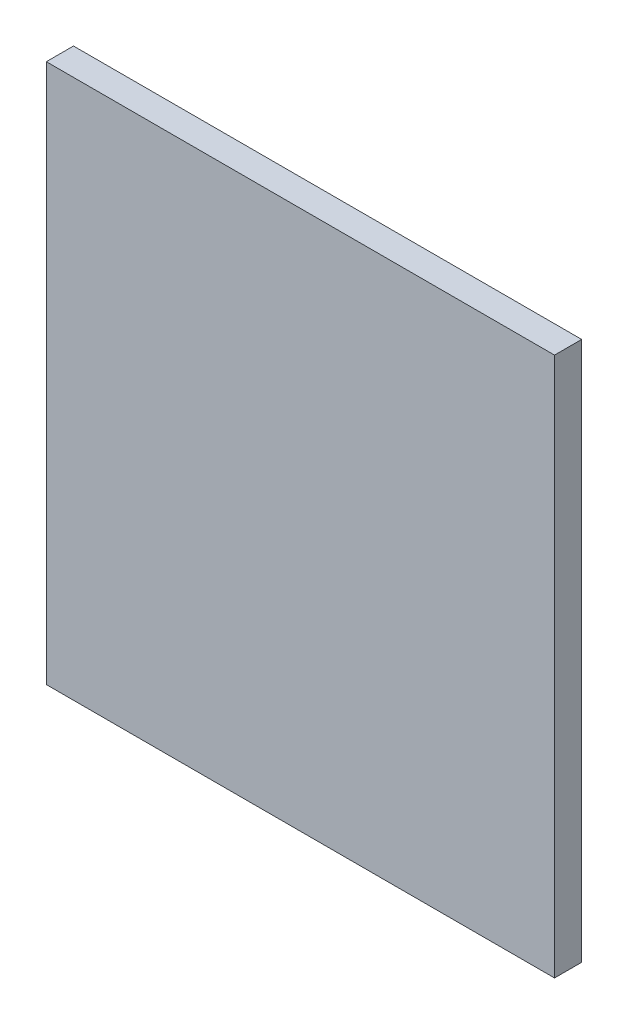
ISO-10303-21;
HEADER;
FILE_DESCRIPTION(('STEP AP214'),'2;1');
FILE_NAME('part.step','',(''),(''),'','','');
FILE_SCHEMA(('AUTOMOTIVE_DESIGN { 1 0 10303 214 1 1 1 1 }'));
ENDSEC;
DATA;
#1=APPLICATION_CONTEXT('core data for automotive mechanical design processes');
#2=APPLICATION_PROTOCOL_DEFINITION('international standard','automotive_design',2000,#1);
#3=PRODUCT_CONTEXT('',#1,'mechanical');
#4=PRODUCT('Part','Part','',(#3));
#5=PRODUCT_RELATED_PRODUCT_CATEGORY('part','',(#4));
#6=PRODUCT_DEFINITION_FORMATION('','',#4);
#7=PRODUCT_DEFINITION_CONTEXT('part definition',#1,'design');
#8=PRODUCT_DEFINITION('design','',#6,#7);
#9=PRODUCT_DEFINITION_SHAPE('','',#8);
#10=(LENGTH_UNIT() NAMED_UNIT(*) SI_UNIT(.MILLI.,.METRE.));
#11=(NAMED_UNIT(*) PLANE_ANGLE_UNIT() SI_UNIT($,.RADIAN.));
#12=(NAMED_UNIT(*) SI_UNIT($,.STERADIAN.) SOLID_ANGLE_UNIT());
#13=UNCERTAINTY_MEASURE_WITH_UNIT(LENGTH_MEASURE(1.E-05),#10,'distance_accuracy_value','');
#14=(GEOMETRIC_REPRESENTATION_CONTEXT(3) GLOBAL_UNCERTAINTY_ASSIGNED_CONTEXT((#13)) GLOBAL_UNIT_ASSIGNED_CONTEXT((#10,
#11,#12)) REPRESENTATION_CONTEXT('',''));
#15=CARTESIAN_POINT('',(0.,0.,0.));
#16=DIRECTION('',(0.,0.,1.));
#17=DIRECTION('',(1.,0.,0.));
#18=AXIS2_PLACEMENT_3D('',#15,#16,#17);
#19=CARTESIAN_POINT('',(0.,0.,1.8));
#20=DIRECTION('',(0.,0.,1.));
#21=DIRECTION('',(1.,0.,0.));
#22=AXIS2_PLACEMENT_3D('',#19,#20,#21);
#23=PLANE('',#22);
#24=DIRECTION('',(-1.,0.,0.));
#25=VECTOR('',#24,1.);
#26=CARTESIAN_POINT('',(0.,16.3489367162519,1.8));
#27=LINE('',#26,#25);
#28=CARTESIAN_POINT('',(-40.9214022690634,16.3489367162519,1.8));
#29=VERTEX_POINT('',#28);
#30=CARTESIAN_POINT('',(-74.598680775992,16.3489367162519,1.8));
#31=VERTEX_POINT('',#30);
#32=EDGE_CURVE('E95',#29,#31,#27,.T.);
#33=ORIENTED_EDGE('',*,*,#32,.T.);
#34=DIRECTION('',(0.,-1.,0.));
#35=VECTOR('',#34,1.);
#36=CARTESIAN_POINT('',(-74.598680775992,0.,1.8));
#37=LINE('',#36,#35);
#38=CARTESIAN_POINT('',(-74.598680775992,-19.3988803486214,1.8));
#39=VERTEX_POINT('',#38);
#40=EDGE_CURVE('E11',#31,#39,#37,.T.);
#41=ORIENTED_EDGE('',*,*,#40,.T.);
#42=DIRECTION('',(1.,0.,0.));
#43=VECTOR('',#42,1.);
#44=CARTESIAN_POINT('',(0.,-19.3988803486214,1.8));
#45=LINE('',#44,#43);
#46=CARTESIAN_POINT('',(-40.9214022690634,-19.3988803486214,1.8));
#47=VERTEX_POINT('',#46);
#48=EDGE_CURVE('E41',#39,#47,#45,.T.);
#49=ORIENTED_EDGE('',*,*,#48,.T.);
#50=DIRECTION('',(0.,1.,0.));
#51=VECTOR('',#50,1.);
#52=CARTESIAN_POINT('',(-40.9214022690634,0.,1.8));
#53=LINE('',#52,#51);
#54=EDGE_CURVE('E99',#47,#29,#53,.T.);
#55=ORIENTED_EDGE('',*,*,#54,.T.);
#56=EDGE_LOOP('',(#33,#41,#49,#55));
#57=FACE_BOUND('',#56,.T.);
#58=ADVANCED_FACE('F33',(#57),#23,.T.);
#59=CARTESIAN_POINT('',(-74.598680775992,-19.3988803486214,16.8));
#60=DIRECTION('',(-1.,0.,0.));
#61=DIRECTION('',(0.,0.,1.));
#62=AXIS2_PLACEMENT_3D('',#59,#60,#61);
#63=PLANE('',#62);
#64=DIRECTION('',(0.,-1.,0.));
#65=VECTOR('',#64,1.);
#66=CARTESIAN_POINT('',(-74.598680775992,0.,0.));
#67=LINE('',#66,#65);
#68=CARTESIAN_POINT('',(-74.598680775992,16.3489367162519,0.));
#69=VERTEX_POINT('',#68);
#70=CARTESIAN_POINT('',(-74.598680775992,-19.3988803486214,0.));
#71=VERTEX_POINT('',#70);
#72=EDGE_CURVE('E139',#69,#71,#67,.T.);
#73=ORIENTED_EDGE('',*,*,#72,.T.);
#74=DIRECTION('',(0.,0.,-1.));
#75=VECTOR('',#74,1.);
#76=CARTESIAN_POINT('',(-74.598680775992,-19.3988803486214,16.8));
#77=LINE('',#76,#75);
#78=EDGE_CURVE('E153',#39,#71,#77,.T.);
#79=ORIENTED_EDGE('',*,*,#78,.F.);
#80=ORIENTED_EDGE('',*,*,#40,.F.);
#81=DIRECTION('',(0.,0.,-1.));
#82=VECTOR('',#81,1.);
#83=CARTESIAN_POINT('',(-74.598680775992,16.3489367162519,16.8));
#84=LINE('',#83,#82);
#85=EDGE_CURVE('E53',#31,#69,#84,.T.);
#86=ORIENTED_EDGE('',*,*,#85,.T.);
#87=EDGE_LOOP('',(#73,#79,#80,#86));
#88=FACE_BOUND('',#87,.T.);
#89=ADVANCED_FACE('F164',(#88),#63,.T.);
#90=CARTESIAN_POINT('',(-74.598680775992,-19.3988803486214,16.8));
#91=DIRECTION('',(0.,-1.,0.));
#92=DIRECTION('',(0.,0.,-1.));
#93=AXIS2_PLACEMENT_3D('',#90,#91,#92);
#94=PLANE('',#93);
#95=DIRECTION('',(1.,0.,0.));
#96=VECTOR('',#95,1.);
#97=CARTESIAN_POINT('',(0.,-19.3988803486214,0.));
#98=LINE('',#97,#96);
#99=CARTESIAN_POINT('',(-40.9214022690634,-19.3988803486214,0.));
#100=VERTEX_POINT('',#99);
#101=EDGE_CURVE('E148',#71,#100,#98,.T.);
#102=ORIENTED_EDGE('',*,*,#101,.T.);
#103=DIRECTION('',(0.,0.,-1.));
#104=VECTOR('',#103,1.);
#105=CARTESIAN_POINT('',(-40.9214022690634,-19.3988803486214,16.8));
#106=LINE('',#105,#104);
#107=EDGE_CURVE('E109',#47,#100,#106,.T.);
#108=ORIENTED_EDGE('',*,*,#107,.F.);
#109=ORIENTED_EDGE('',*,*,#48,.F.);
#110=ORIENTED_EDGE('',*,*,#78,.T.);
#111=EDGE_LOOP('',(#102,#108,#109,#110));
#112=FACE_BOUND('',#111,.T.);
#113=ADVANCED_FACE('F160',(#112),#94,.T.);
#114=CARTESIAN_POINT('',(-40.9214022690634,-19.3988803486214,16.8));
#115=DIRECTION('',(1.,0.,0.));
#116=DIRECTION('',(0.,0.,-1.));
#117=AXIS2_PLACEMENT_3D('',#114,#115,#116);
#118=PLANE('',#117);
#119=DIRECTION('',(0.,1.,0.));
#120=VECTOR('',#119,1.);
#121=CARTESIAN_POINT('',(-40.9214022690634,0.,0.));
#122=LINE('',#121,#120);
#123=CARTESIAN_POINT('',(-40.9214022690634,16.3489367162519,0.));
#124=VERTEX_POINT('',#123);
#125=EDGE_CURVE('E107',#100,#124,#122,.T.);
#126=ORIENTED_EDGE('',*,*,#125,.T.);
#127=DIRECTION('',(0.,0.,-1.));
#128=VECTOR('',#127,1.);
#129=CARTESIAN_POINT('',(-40.9214022690634,16.3489367162519,16.8));
#130=LINE('',#129,#128);
#131=EDGE_CURVE('E48',#29,#124,#130,.T.);
#132=ORIENTED_EDGE('',*,*,#131,.F.);
#133=ORIENTED_EDGE('',*,*,#54,.F.);
#134=ORIENTED_EDGE('',*,*,#107,.T.);
#135=EDGE_LOOP('',(#126,#132,#133,#134));
#136=FACE_BOUND('',#135,.T.);
#137=ADVANCED_FACE('F103',(#136),#118,.T.);
#138=CARTESIAN_POINT('',(-74.598680775992,16.3489367162519,16.8));
#139=DIRECTION('',(0.,1.,0.));
#140=DIRECTION('',(0.,0.,1.));
#141=AXIS2_PLACEMENT_3D('',#138,#139,#140);
#142=PLANE('',#141);
#143=DIRECTION('',(-1.,0.,0.));
#144=VECTOR('',#143,1.);
#145=CARTESIAN_POINT('',(0.,16.3489367162519,0.));
#146=LINE('',#145,#144);
#147=EDGE_CURVE('E151',#124,#69,#146,.T.);
#148=ORIENTED_EDGE('',*,*,#147,.T.);
#149=ORIENTED_EDGE('',*,*,#85,.F.);
#150=ORIENTED_EDGE('',*,*,#32,.F.);
#151=ORIENTED_EDGE('',*,*,#131,.T.);
#152=EDGE_LOOP('',(#148,#149,#150,#151));
#153=FACE_BOUND('',#152,.T.);
#154=ADVANCED_FACE('F96',(#153),#142,.T.);
#155=CARTESIAN_POINT('',(0.,0.,0.));
#156=DIRECTION('',(0.,0.,1.));
#157=DIRECTION('',(1.,0.,0.));
#158=AXIS2_PLACEMENT_3D('',#155,#156,#157);
#159=PLANE('',#158);
#160=DIRECTION('',(0.,-1.,0.));
#161=VECTOR('',#160,1.);
#162=CARTESIAN_POINT('',(-54.2115384615385,8.4076923076923,0.));
#163=LINE('',#162,#161);
#164=CARTESIAN_POINT('',(-54.2115384615385,8.4076923076923,0.));
#165=VERTEX_POINT('',#164);
#166=CARTESIAN_POINT('',(-54.2115384615385,-14.5923076923077,0.));
#167=VERTEX_POINT('',#166);
#168=EDGE_CURVE('E121',#165,#167,#163,.T.);
#169=ORIENTED_EDGE('',*,*,#168,.F.);
#170=DIRECTION('',(1.,0.,0.));
#171=VECTOR('',#170,1.);
#172=CARTESIAN_POINT('',(-51.2115384615384,8.4076923076923,0.));
#173=LINE('',#172,#171);
#174=CARTESIAN_POINT('',(-62.2115384615385,8.4076923076923,0.));
#175=VERTEX_POINT('',#174);
#176=EDGE_CURVE('E118',#175,#165,#173,.T.);
#177=ORIENTED_EDGE('',*,*,#176,.F.);
#178=DIRECTION('',(0.,-1.,0.));
#179=VECTOR('',#178,1.);
#180=CARTESIAN_POINT('',(-62.2115384615385,8.4076923076923,0.));
#181=LINE('',#180,#179);
#182=CARTESIAN_POINT('',(-62.2115384615385,-14.5923076923077,0.));
#183=VERTEX_POINT('',#182);
#184=EDGE_CURVE('E132',#175,#183,#181,.T.);
#185=ORIENTED_EDGE('',*,*,#184,.T.);
#186=DIRECTION('',(-1.,0.,0.));
#187=VECTOR('',#186,1.);
#188=CARTESIAN_POINT('',(-51.2115384615384,-14.5923076923077,0.));
#189=LINE('',#188,#187);
#190=EDGE_CURVE('E114',#167,#183,#189,.T.);
#191=ORIENTED_EDGE('',*,*,#190,.F.);
#192=EDGE_LOOP('',(#169,#177,#185,#191));
#193=FACE_BOUND('',#192,.T.);
#194=ORIENTED_EDGE('',*,*,#72,.F.);
#195=ORIENTED_EDGE('',*,*,#147,.F.);
#196=ORIENTED_EDGE('',*,*,#125,.F.);
#197=ORIENTED_EDGE('',*,*,#101,.F.);
#198=EDGE_LOOP('',(#194,#195,#196,#197));
#199=FACE_BOUND('',#198,.T.);
#200=ADVANCED_FACE('F35',(#193,#199),#159,.F.);
#201=CARTESIAN_POINT('',(-51.2115384615384,8.4076923076923,-3.));
#202=DIRECTION('',(0.,-1.,0.));
#203=DIRECTION('',(0.,0.,-1.));
#204=AXIS2_PLACEMENT_3D('',#201,#202,#203);
#205=PLANE('',#204);
#206=ORIENTED_EDGE('',*,*,#176,.T.);
#207=DIRECTION('',(0.707106781186551,0.,-0.707106781186544));
#208=VECTOR('',#207,1.);
#209=CARTESIAN_POINT('',(-51.2115384615384,8.4076923076923,-3.));
#210=LINE('',#209,#208);
#211=CARTESIAN_POINT('',(-51.2115384615384,8.4076923076923,-3.));
#212=VERTEX_POINT('',#211);
#213=EDGE_CURVE('E143',#165,#212,#210,.T.);
#214=ORIENTED_EDGE('',*,*,#213,.T.);
#215=DIRECTION('',(1.,0.,0.));
#216=VECTOR('',#215,1.);
#217=CARTESIAN_POINT('',(-51.2115384615384,8.4076923076923,-3.));
#218=LINE('',#217,#216);
#219=CARTESIAN_POINT('',(-65.2115384615384,8.4076923076923,-3.));
#220=VERTEX_POINT('',#219);
#221=EDGE_CURVE('E127',#220,#212,#218,.T.);
#222=ORIENTED_EDGE('',*,*,#221,.F.);
#223=DIRECTION('',(0.707106781186544,0.,0.707106781186551));
#224=VECTOR('',#223,1.);
#225=CARTESIAN_POINT('',(-65.2115384615384,8.4076923076923,-3.));
#226=LINE('',#225,#224);
#227=EDGE_CURVE('E135',#220,#175,#226,.T.);
#228=ORIENTED_EDGE('',*,*,#227,.T.);
#229=EDGE_LOOP('',(#206,#214,#222,#228));
#230=FACE_BOUND('',#229,.T.);
#231=ADVANCED_FACE('F190',(#230),#205,.F.);
#232=CARTESIAN_POINT('',(-51.2115384615384,-14.5923076923077,-3.));
#233=DIRECTION('',(0.,1.,0.));
#234=DIRECTION('',(0.,0.,1.));
#235=AXIS2_PLACEMENT_3D('',#232,#233,#234);
#236=PLANE('',#235);
#237=DIRECTION('',(-1.,0.,0.));
#238=VECTOR('',#237,1.);
#239=CARTESIAN_POINT('',(-51.2115384615384,-14.5923076923077,-3.));
#240=LINE('',#239,#238);
#241=CARTESIAN_POINT('',(-51.2115384615384,-14.5923076923077,-3.));
#242=VERTEX_POINT('',#241);
#243=CARTESIAN_POINT('',(-65.2115384615384,-14.5923076923077,-3.));
#244=VERTEX_POINT('',#243);
#245=EDGE_CURVE('E100',#242,#244,#240,.T.);
#246=ORIENTED_EDGE('',*,*,#245,.F.);
#247=DIRECTION('',(0.707106781186551,0.,-0.707106781186544));
#248=VECTOR('',#247,1.);
#249=CARTESIAN_POINT('',(-51.2115384615384,-14.5923076923077,-3.));
#250=LINE('',#249,#248);
#251=EDGE_CURVE('E134',#167,#242,#250,.T.);
#252=ORIENTED_EDGE('',*,*,#251,.F.);
#253=ORIENTED_EDGE('',*,*,#190,.T.);
#254=DIRECTION('',(0.707106781186544,0.,0.707106781186551));
#255=VECTOR('',#254,1.);
#256=CARTESIAN_POINT('',(-65.2115384615384,-14.5923076923077,-3.));
#257=LINE('',#256,#255);
#258=EDGE_CURVE('E136',#244,#183,#257,.T.);
#259=ORIENTED_EDGE('',*,*,#258,.F.);
#260=EDGE_LOOP('',(#246,#252,#253,#259));
#261=FACE_BOUND('',#260,.T.);
#262=ADVANCED_FACE('F186',(#261),#236,.F.);
#263=CARTESIAN_POINT('',(0.,0.,-3.));
#264=DIRECTION('',(0.,0.,1.));
#265=DIRECTION('',(1.,0.,0.));
#266=AXIS2_PLACEMENT_3D('',#263,#264,#265);
#267=PLANE('',#266);
#268=DIRECTION('',(0.,1.,0.));
#269=VECTOR('',#268,1.);
#270=CARTESIAN_POINT('',(-65.2115384615384,-14.5923076923077,-3.));
#271=LINE('',#270,#269);
#272=EDGE_CURVE('E117',#244,#220,#271,.T.);
#273=ORIENTED_EDGE('',*,*,#272,.T.);
#274=ORIENTED_EDGE('',*,*,#221,.T.);
#275=DIRECTION('',(0.,-1.,0.));
#276=VECTOR('',#275,1.);
#277=CARTESIAN_POINT('',(-51.2115384615384,-14.5923076923077,-3.));
#278=LINE('',#277,#276);
#279=EDGE_CURVE('E124',#212,#242,#278,.T.);
#280=ORIENTED_EDGE('',*,*,#279,.T.);
#281=ORIENTED_EDGE('',*,*,#245,.T.);
#282=EDGE_LOOP('',(#273,#274,#280,#281));
#283=FACE_BOUND('',#282,.T.);
#284=ADVANCED_FACE('F182',(#283),#267,.F.);
#285=CARTESIAN_POINT('',(-65.2115384615384,8.4076923076923,-3.));
#286=DIRECTION('',(0.707106781186551,0.,-0.707106781186544));
#287=DIRECTION('',(-0.707106781186544,0.,-0.707106781186551));
#288=AXIS2_PLACEMENT_3D('',#285,#286,#287);
#289=PLANE('',#288);
#290=ORIENTED_EDGE('',*,*,#258,.T.);
#291=ORIENTED_EDGE('',*,*,#184,.F.);
#292=ORIENTED_EDGE('',*,*,#227,.F.);
#293=ORIENTED_EDGE('',*,*,#272,.F.);
#294=EDGE_LOOP('',(#290,#291,#292,#293));
#295=FACE_BOUND('',#294,.T.);
#296=ADVANCED_FACE('F178',(#295),#289,.F.);
#297=CARTESIAN_POINT('',(-51.2115384615384,8.4076923076923,-3.));
#298=DIRECTION('',(-0.707106781186544,0.,-0.707106781186551));
#299=DIRECTION('',(-0.707106781186551,0.,0.707106781186544));
#300=AXIS2_PLACEMENT_3D('',#297,#298,#299);
#301=PLANE('',#300);
#302=ORIENTED_EDGE('',*,*,#251,.T.);
#303=ORIENTED_EDGE('',*,*,#279,.F.);
#304=ORIENTED_EDGE('',*,*,#213,.F.);
#305=ORIENTED_EDGE('',*,*,#168,.T.);
#306=EDGE_LOOP('',(#302,#303,#304,#305));
#307=FACE_BOUND('',#306,.T.);
#308=ADVANCED_FACE('F175',(#307),#301,.F.);
#309=CLOSED_SHELL('',(#58,#89,#113,#137,#154,#200,#231,#262,#284,#296,#308));
#310=MANIFOLD_SOLID_BREP('B2',#309);
#311=ADVANCED_BREP_SHAPE_REPRESENTATION('',(#18,#310),#14);
#312=SHAPE_DEFINITION_REPRESENTATION(#9,#311);
ENDSEC;
END-ISO-10303-21;
